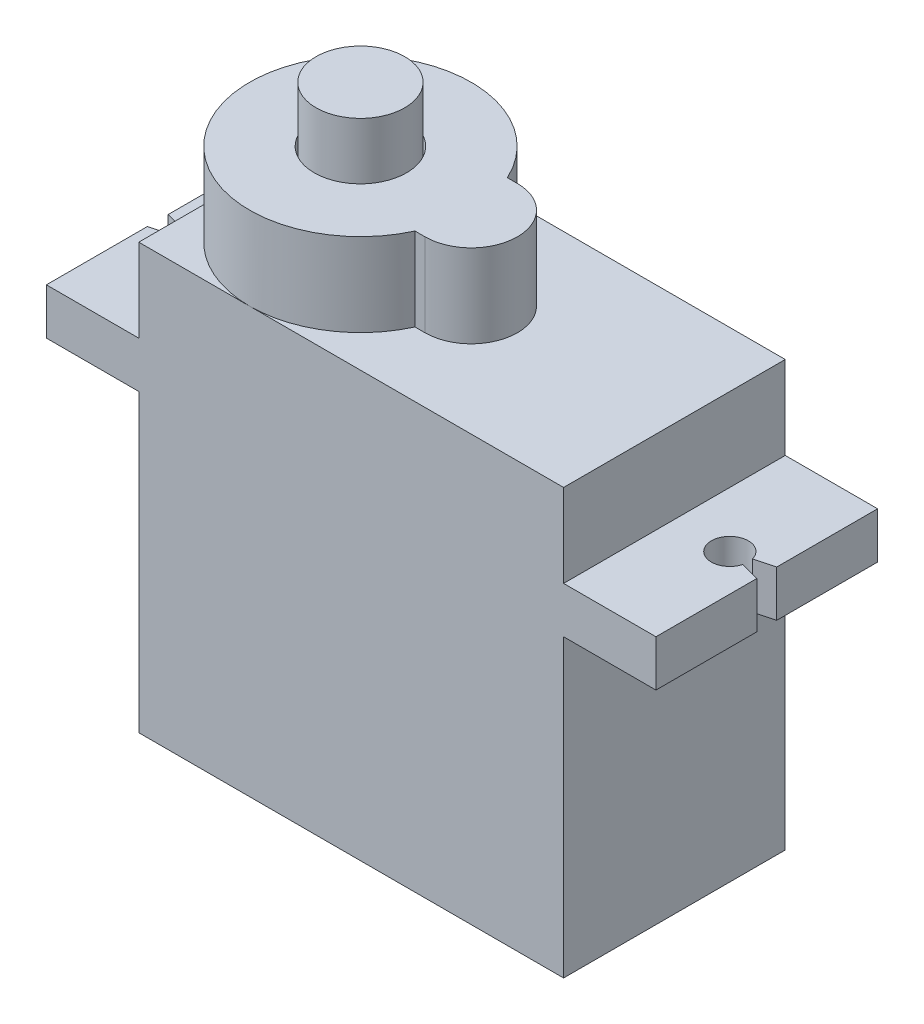
ISO-10303-21;
HEADER;
FILE_DESCRIPTION(('STEP AP214'),'2;1');
FILE_NAME('part.step','',(''),(''),'','','');
FILE_SCHEMA(('AUTOMOTIVE_DESIGN { 1 0 10303 214 1 1 1 1 }'));
ENDSEC;
DATA;
#1=APPLICATION_CONTEXT('core data for automotive mechanical design processes');
#2=APPLICATION_PROTOCOL_DEFINITION('international standard','automotive_design',2000,#1);
#3=PRODUCT_CONTEXT('',#1,'mechanical');
#4=PRODUCT('Part','Part','',(#3));
#5=PRODUCT_RELATED_PRODUCT_CATEGORY('part','',(#4));
#6=PRODUCT_DEFINITION_FORMATION('','',#4);
#7=PRODUCT_DEFINITION_CONTEXT('part definition',#1,'design');
#8=PRODUCT_DEFINITION('design','',#6,#7);
#9=PRODUCT_DEFINITION_SHAPE('','',#8);
#10=(LENGTH_UNIT() NAMED_UNIT(*) SI_UNIT(.MILLI.,.METRE.));
#11=(NAMED_UNIT(*) PLANE_ANGLE_UNIT() SI_UNIT($,.RADIAN.));
#12=(NAMED_UNIT(*) SI_UNIT($,.STERADIAN.) SOLID_ANGLE_UNIT());
#13=UNCERTAINTY_MEASURE_WITH_UNIT(LENGTH_MEASURE(1.E-05),#10,'distance_accuracy_value','');
#14=(GEOMETRIC_REPRESENTATION_CONTEXT(3) GLOBAL_UNCERTAINTY_ASSIGNED_CONTEXT((#13)) GLOBAL_UNIT_ASSIGNED_CONTEXT((#10,
#11,#12)) REPRESENTATION_CONTEXT('',''));
#15=CARTESIAN_POINT('',(0.,0.,0.));
#16=DIRECTION('',(0.,0.,1.));
#17=DIRECTION('',(1.,0.,0.));
#18=AXIS2_PLACEMENT_3D('',#15,#16,#17);
#19=CARTESIAN_POINT('',(16.5,7.,-6.));
#20=DIRECTION('',(1.,0.,0.));
#21=DIRECTION('',(0.,0.,-1.));
#22=AXIS2_PLACEMENT_3D('',#19,#20,#21);
#23=PLANE('',#22);
#24=DIRECTION('',(0.,1.,0.));
#25=VECTOR('',#24,1.);
#26=CARTESIAN_POINT('',(16.5,3.5,-0.53589838486223));
#27=LINE('',#26,#25);
#28=CARTESIAN_POINT('',(16.5,4.5,-0.53589838486223));
#29=VERTEX_POINT('',#28);
#30=CARTESIAN_POINT('',(16.5,7.,-0.53589838486223));
#31=VERTEX_POINT('',#30);
#32=EDGE_CURVE('E227',#29,#31,#27,.T.);
#33=ORIENTED_EDGE('',*,*,#32,.F.);
#34=DIRECTION('',(0.,0.,1.));
#35=VECTOR('',#34,1.);
#36=CARTESIAN_POINT('',(16.5,4.5,-6.));
#37=LINE('',#36,#35);
#38=CARTESIAN_POINT('',(16.5,4.5,-6.));
#39=VERTEX_POINT('',#38);
#40=EDGE_CURVE('E378',#39,#29,#37,.T.);
#41=ORIENTED_EDGE('',*,*,#40,.F.);
#42=DIRECTION('',(0.,1.,0.));
#43=VECTOR('',#42,1.);
#44=CARTESIAN_POINT('',(16.5,7.,-6.));
#45=LINE('',#44,#43);
#46=CARTESIAN_POINT('',(16.5,7.,-6.));
#47=VERTEX_POINT('',#46);
#48=EDGE_CURVE('E366',#39,#47,#45,.T.);
#49=ORIENTED_EDGE('',*,*,#48,.T.);
#50=DIRECTION('',(0.,0.,1.));
#51=VECTOR('',#50,1.);
#52=CARTESIAN_POINT('',(16.5,7.,-6.));
#53=LINE('',#52,#51);
#54=EDGE_CURVE('E375',#47,#31,#53,.T.);
#55=ORIENTED_EDGE('',*,*,#54,.T.);
#56=EDGE_LOOP('',(#33,#41,#49,#55));
#57=FACE_BOUND('',#56,.T.);
#58=ADVANCED_FACE('F32',(#57),#23,.T.);
#59=CARTESIAN_POINT('',(-16.5,7.,-6.));
#60=DIRECTION('',(-1.,0.,0.));
#61=DIRECTION('',(0.,0.,1.));
#62=AXIS2_PLACEMENT_3D('',#59,#60,#61);
#63=PLANE('',#62);
#64=DIRECTION('',(0.,1.,0.));
#65=VECTOR('',#64,1.);
#66=CARTESIAN_POINT('',(-16.5,3.5,0.535898384862233));
#67=LINE('',#66,#65);
#68=CARTESIAN_POINT('',(-16.5,4.5,0.535898384862233));
#69=VERTEX_POINT('',#68);
#70=CARTESIAN_POINT('',(-16.5,7.,0.535898384862233));
#71=VERTEX_POINT('',#70);
#72=EDGE_CURVE('E240',#69,#71,#67,.T.);
#73=ORIENTED_EDGE('',*,*,#72,.F.);
#74=DIRECTION('',(0.,0.,1.));
#75=VECTOR('',#74,1.);
#76=CARTESIAN_POINT('',(-16.5,4.49999999999999,-6.));
#77=LINE('',#76,#75);
#78=CARTESIAN_POINT('',(-16.5,4.49999999999999,6.));
#79=VERTEX_POINT('',#78);
#80=EDGE_CURVE('E393',#69,#79,#77,.T.);
#81=ORIENTED_EDGE('',*,*,#80,.T.);
#82=DIRECTION('',(0.,-1.,0.));
#83=VECTOR('',#82,1.);
#84=CARTESIAN_POINT('',(-16.5,7.,6.));
#85=LINE('',#84,#83);
#86=CARTESIAN_POINT('',(-16.5,7.,6.));
#87=VERTEX_POINT('',#86);
#88=EDGE_CURVE('E311',#87,#79,#85,.T.);
#89=ORIENTED_EDGE('',*,*,#88,.F.);
#90=DIRECTION('',(0.,0.,1.));
#91=VECTOR('',#90,1.);
#92=CARTESIAN_POINT('',(-16.5,7.,-6.));
#93=LINE('',#92,#91);
#94=EDGE_CURVE('E397',#71,#87,#93,.T.);
#95=ORIENTED_EDGE('',*,*,#94,.F.);
#96=EDGE_LOOP('',(#73,#81,#89,#95));
#97=FACE_BOUND('',#96,.T.);
#98=ADVANCED_FACE('F478',(#97),#63,.T.);
#99=CARTESIAN_POINT('',(-11.5,11.5,-6.));
#100=DIRECTION('',(0.,1.,0.));
#101=DIRECTION('',(0.,0.,1.));
#102=AXIS2_PLACEMENT_3D('',#99,#100,#101);
#103=PLANE('',#102);
#104=CARTESIAN_POINT('',(-5.50000000000001,11.5,0.));
#105=DIRECTION('',(0.,1.,0.));
#106=DIRECTION('',(0.,0.,1.));
#107=AXIS2_PLACEMENT_3D('',#104,#105,#106);
#108=CIRCLE('',#107,2.5);
#109=CARTESIAN_POINT('',(-5.50000000000001,11.5,2.5));
#110=VERTEX_POINT('',#109);
#111=EDGE_CURVE('E255',#110,#110,#108,.T.);
#112=ORIENTED_EDGE('',*,*,#111,.T.);
#113=EDGE_LOOP('',(#112));
#114=FACE_BOUND('',#113,.T.);
#115=CARTESIAN_POINT('',(-5.50000000000001,11.5,0.));
#116=DIRECTION('',(0.,1.,0.));
#117=DIRECTION('',(0.,0.,1.));
#118=AXIS2_PLACEMENT_3D('',#115,#116,#117);
#119=CIRCLE('',#118,2.4);
#120=CARTESIAN_POINT('',(-5.50000000000001,11.5,2.4));
#121=VERTEX_POINT('',#120);
#122=EDGE_CURVE('E251',#121,#121,#119,.T.);
#123=ORIENTED_EDGE('',*,*,#122,.F.);
#124=EDGE_LOOP('',(#123));
#125=FACE_BOUND('',#124,.T.);
#126=ADVANCED_FACE('F475',(#114,#125),#103,.T.);
#127=CARTESIAN_POINT('',(-5.50000000000001,11.5,0.));
#128=DIRECTION('',(0.,1.,0.));
#129=DIRECTION('',(0.,0.,1.));
#130=AXIS2_PLACEMENT_3D('',#127,#128,#129);
#131=CIRCLE('',#130,6.);
#132=CARTESIAN_POINT('',(-11.5,11.5,0.));
#133=VERTEX_POINT('',#132);
#134=CARTESIAN_POINT('',(-5.50000000000001,11.5,6.));
#135=VERTEX_POINT('',#134);
#136=EDGE_CURVE('E283',#133,#135,#131,.T.);
#137=ORIENTED_EDGE('',*,*,#136,.F.);
#138=DIRECTION('',(0.,0.,1.));
#139=VECTOR('',#138,1.);
#140=CARTESIAN_POINT('',(-11.5,11.5,-6.));
#141=LINE('',#140,#139);
#142=CARTESIAN_POINT('',(-11.5,11.5,6.));
#143=VERTEX_POINT('',#142);
#144=EDGE_CURVE('E403',#133,#143,#141,.T.);
#145=ORIENTED_EDGE('',*,*,#144,.T.);
#146=DIRECTION('',(-1.,0.,0.));
#147=VECTOR('',#146,1.);
#148=CARTESIAN_POINT('',(-11.5,11.5,6.));
#149=LINE('',#148,#147);
#150=EDGE_CURVE('E301',#135,#143,#149,.T.);
#151=ORIENTED_EDGE('',*,*,#150,.F.);
#152=EDGE_LOOP('',(#137,#145,#151));
#153=FACE_BOUND('',#152,.T.);
#154=ADVANCED_FACE('F439',(#153),#103,.T.);
#155=CARTESIAN_POINT('',(-0.0456439426821482,11.5,2.5));
#156=VERTEX_POINT('',#155);
#157=EDGE_CURVE('E429',#135,#156,#131,.T.);
#158=ORIENTED_EDGE('',*,*,#157,.F.);
#159=CARTESIAN_POINT('',(11.5,11.5,6.));
#160=VERTEX_POINT('',#159);
#161=EDGE_CURVE('E302',#160,#135,#149,.T.);
#162=ORIENTED_EDGE('',*,*,#161,.F.);
#163=DIRECTION('',(0.,0.,1.));
#164=VECTOR('',#163,1.);
#165=CARTESIAN_POINT('',(11.5,11.5,-6.));
#166=LINE('',#165,#164);
#167=CARTESIAN_POINT('',(11.5,11.5,-6.));
#168=VERTEX_POINT('',#167);
#169=EDGE_CURVE('E372',#168,#160,#166,.T.);
#170=ORIENTED_EDGE('',*,*,#169,.F.);
#171=DIRECTION('',(-1.,0.,0.));
#172=VECTOR('',#171,1.);
#173=CARTESIAN_POINT('',(-11.5,11.5,-6.));
#174=LINE('',#173,#172);
#175=CARTESIAN_POINT('',(-5.50000000000001,11.5,-6.));
#176=VERTEX_POINT('',#175);
#177=EDGE_CURVE('E339',#168,#176,#174,.T.);
#178=ORIENTED_EDGE('',*,*,#177,.T.);
#179=CARTESIAN_POINT('',(-0.0456439426821482,11.5,-2.5));
#180=VERTEX_POINT('',#179);
#181=EDGE_CURVE('E280',#180,#176,#131,.T.);
#182=ORIENTED_EDGE('',*,*,#181,.F.);
#183=DIRECTION('',(-1.,0.,0.));
#184=VECTOR('',#183,1.);
#185=CARTESIAN_POINT('',(0.499999999999994,11.5,-2.5));
#186=LINE('',#185,#184);
#187=CARTESIAN_POINT('',(0.499999999999994,11.5,-2.5));
#188=VERTEX_POINT('',#187);
#189=EDGE_CURVE('E277',#188,#180,#186,.T.);
#190=ORIENTED_EDGE('',*,*,#189,.F.);
#191=CARTESIAN_POINT('',(0.499999999999994,11.5,0.));
#192=DIRECTION('',(0.,1.,0.));
#193=DIRECTION('',(0.,0.,1.));
#194=AXIS2_PLACEMENT_3D('',#191,#192,#193);
#195=CIRCLE('',#194,2.5);
#196=CARTESIAN_POINT('',(0.499999999999994,11.5,2.5));
#197=VERTEX_POINT('',#196);
#198=EDGE_CURVE('E261',#197,#188,#195,.T.);
#199=ORIENTED_EDGE('',*,*,#198,.F.);
#200=DIRECTION('',(1.,0.,0.));
#201=VECTOR('',#200,1.);
#202=CARTESIAN_POINT('',(0.499999999999994,11.5,2.5));
#203=LINE('',#202,#201);
#204=EDGE_CURVE('E268',#156,#197,#203,.T.);
#205=ORIENTED_EDGE('',*,*,#204,.F.);
#206=EDGE_LOOP('',(#158,#162,#170,#178,#182,#190,#199,#205));
#207=FACE_BOUND('',#206,.T.);
#208=ADVANCED_FACE('F427',(#207),#103,.T.);
#209=CARTESIAN_POINT('',(11.5,7.,-6.));
#210=DIRECTION('',(1.,0.,0.));
#211=DIRECTION('',(0.,0.,-1.));
#212=AXIS2_PLACEMENT_3D('',#209,#210,#211);
#213=PLANE('',#212);
#214=ORIENTED_EDGE('',*,*,#169,.T.);
#215=DIRECTION('',(0.,1.,0.));
#216=VECTOR('',#215,1.);
#217=CARTESIAN_POINT('',(11.5,7.,6.));
#218=LINE('',#217,#216);
#219=CARTESIAN_POINT('',(11.5,7.,6.));
#220=VERTEX_POINT('',#219);
#221=EDGE_CURVE('E298',#220,#160,#218,.T.);
#222=ORIENTED_EDGE('',*,*,#221,.F.);
#223=DIRECTION('',(0.,0.,1.));
#224=VECTOR('',#223,1.);
#225=CARTESIAN_POINT('',(11.5,7.,-6.));
#226=LINE('',#225,#224);
#227=CARTESIAN_POINT('',(11.5,7.,-6.));
#228=VERTEX_POINT('',#227);
#229=EDGE_CURVE('E373',#228,#220,#226,.T.);
#230=ORIENTED_EDGE('',*,*,#229,.F.);
#231=DIRECTION('',(0.,1.,0.));
#232=VECTOR('',#231,1.);
#233=CARTESIAN_POINT('',(11.5,7.,-6.));
#234=LINE('',#233,#232);
#235=EDGE_CURVE('E335',#228,#168,#234,.T.);
#236=ORIENTED_EDGE('',*,*,#235,.T.);
#237=EDGE_LOOP('',(#214,#222,#230,#236));
#238=FACE_BOUND('',#237,.T.);
#239=ADVANCED_FACE('F34',(#238),#213,.T.);
#240=CARTESIAN_POINT('',(11.5,7.,-6.));
#241=DIRECTION('',(0.,1.,0.));
#242=DIRECTION('',(-1.,0.,0.));
#243=AXIS2_PLACEMENT_3D('',#240,#241,#242);
#244=PLANE('',#243);
#245=DIRECTION('',(-0.96592582628907,0.,0.258819045102514));
#246=VECTOR('',#245,1.);
#247=CARTESIAN_POINT('',(15.4659258262891,7.,-0.258819045102514));
#248=LINE('',#247,#246);
#249=CARTESIAN_POINT('',(15.4659258262891,7.,-0.258819045102514));
#250=VERTEX_POINT('',#249);
#251=EDGE_CURVE('E208',#31,#250,#248,.T.);
#252=ORIENTED_EDGE('',*,*,#251,.F.);
#253=ORIENTED_EDGE('',*,*,#54,.F.);
#254=DIRECTION('',(-1.,0.,0.));
#255=VECTOR('',#254,1.);
#256=CARTESIAN_POINT('',(11.5,7.,-6.));
#257=LINE('',#256,#255);
#258=EDGE_CURVE('E369',#47,#228,#257,.T.);
#259=ORIENTED_EDGE('',*,*,#258,.T.);
#260=ORIENTED_EDGE('',*,*,#229,.T.);
#261=DIRECTION('',(-1.,0.,0.));
#262=VECTOR('',#261,1.);
#263=CARTESIAN_POINT('',(11.5,7.,6.));
#264=LINE('',#263,#262);
#265=CARTESIAN_POINT('',(16.5,7.,6.));
#266=VERTEX_POINT('',#265);
#267=EDGE_CURVE('E332',#266,#220,#264,.T.);
#268=ORIENTED_EDGE('',*,*,#267,.F.);
#269=CARTESIAN_POINT('',(16.5,7.,0.535898384862212));
#270=VERTEX_POINT('',#269);
#271=EDGE_CURVE('E222',#270,#266,#53,.T.);
#272=ORIENTED_EDGE('',*,*,#271,.F.);
#273=DIRECTION('',(0.965925826289072,0.,0.258819045102506));
#274=VECTOR('',#273,1.);
#275=CARTESIAN_POINT('',(16.5,7.,0.535898384862212));
#276=LINE('',#275,#274);
#277=CARTESIAN_POINT('',(15.4659258262891,7.,0.258819045102506));
#278=VERTEX_POINT('',#277);
#279=EDGE_CURVE('E204',#278,#270,#276,.T.);
#280=ORIENTED_EDGE('',*,*,#279,.F.);
#281=CARTESIAN_POINT('',(14.5,7.,0.));
#282=DIRECTION('',(0.,1.,0.));
#283=DIRECTION('',(0.,0.,1.));
#284=AXIS2_PLACEMENT_3D('',#281,#282,#283);
#285=CIRCLE('',#284,1.);
#286=EDGE_CURVE('E211',#250,#278,#285,.T.);
#287=ORIENTED_EDGE('',*,*,#286,.F.);
#288=EDGE_LOOP('',(#252,#253,#259,#260,#268,#272,#280,#287));
#289=FACE_BOUND('',#288,.T.);
#290=ADVANCED_FACE('F220',(#289),#244,.T.);
#291=DIRECTION('',(0.,1.,0.));
#292=VECTOR('',#291,1.);
#293=CARTESIAN_POINT('',(16.5,3.5,0.535898384862212));
#294=LINE('',#293,#292);
#295=CARTESIAN_POINT('',(16.5,4.5,0.535898384862209));
#296=VERTEX_POINT('',#295);
#297=EDGE_CURVE('E47',#296,#270,#294,.T.);
#298=ORIENTED_EDGE('',*,*,#297,.T.);
#299=ORIENTED_EDGE('',*,*,#271,.T.);
#300=DIRECTION('',(0.,1.,0.));
#301=VECTOR('',#300,1.);
#302=CARTESIAN_POINT('',(16.5,7.,6.));
#303=LINE('',#302,#301);
#304=CARTESIAN_POINT('',(16.5,4.5,6.));
#305=VERTEX_POINT('',#304);
#306=EDGE_CURVE('E329',#305,#266,#303,.T.);
#307=ORIENTED_EDGE('',*,*,#306,.F.);
#308=EDGE_CURVE('E381',#296,#305,#37,.T.);
#309=ORIENTED_EDGE('',*,*,#308,.F.);
#310=EDGE_LOOP('',(#298,#299,#307,#309));
#311=FACE_BOUND('',#310,.T.);
#312=ADVANCED_FACE('F494',(#311),#23,.T.);
#313=CARTESIAN_POINT('',(16.5,4.5,-6.));
#314=DIRECTION('',(0.,-1.,0.));
#315=DIRECTION('',(1.,0.,0.));
#316=AXIS2_PLACEMENT_3D('',#313,#314,#315);
#317=PLANE('',#316);
#318=DIRECTION('',(0.96592582628907,0.,-0.258819045102514));
#319=VECTOR('',#318,1.);
#320=CARTESIAN_POINT('',(17.8660254037844,4.5,-0.901923788646649));
#321=LINE('',#320,#319);
#322=CARTESIAN_POINT('',(15.4659258262891,4.5,-0.258819045102514));
#323=VERTEX_POINT('',#322);
#324=EDGE_CURVE('E11',#323,#29,#321,.T.);
#325=ORIENTED_EDGE('',*,*,#324,.F.);
#326=CARTESIAN_POINT('',(14.5,4.5,0.));
#327=DIRECTION('',(0.,-1.,0.));
#328=DIRECTION('',(1.,0.,0.));
#329=AXIS2_PLACEMENT_3D('',#326,#327,#328);
#330=CIRCLE('',#329,1.);
#331=CARTESIAN_POINT('',(15.4659258262891,4.5,0.258819045102506));
#332=VERTEX_POINT('',#331);
#333=EDGE_CURVE('E40',#332,#323,#330,.T.);
#334=ORIENTED_EDGE('',*,*,#333,.F.);
#335=DIRECTION('',(-0.965925826289073,0.,-0.258819045102506));
#336=VECTOR('',#335,1.);
#337=CARTESIAN_POINT('',(14.8660254037845,4.5,0.0980762113533349));
#338=LINE('',#337,#336);
#339=EDGE_CURVE('E205',#296,#332,#338,.T.);
#340=ORIENTED_EDGE('',*,*,#339,.F.);
#341=ORIENTED_EDGE('',*,*,#308,.T.);
#342=DIRECTION('',(1.,0.,0.));
#343=VECTOR('',#342,1.);
#344=CARTESIAN_POINT('',(16.5,4.5,6.));
#345=LINE('',#344,#343);
#346=CARTESIAN_POINT('',(11.5,4.5,6.));
#347=VERTEX_POINT('',#346);
#348=EDGE_CURVE('E326',#347,#305,#345,.T.);
#349=ORIENTED_EDGE('',*,*,#348,.F.);
#350=DIRECTION('',(0.,0.,1.));
#351=VECTOR('',#350,1.);
#352=CARTESIAN_POINT('',(11.5,4.5,-6.));
#353=LINE('',#352,#351);
#354=CARTESIAN_POINT('',(11.5,4.5,-6.));
#355=VERTEX_POINT('',#354);
#356=EDGE_CURVE('E382',#355,#347,#353,.T.);
#357=ORIENTED_EDGE('',*,*,#356,.F.);
#358=DIRECTION('',(1.,0.,0.));
#359=VECTOR('',#358,1.);
#360=CARTESIAN_POINT('',(16.5,4.5,-6.));
#361=LINE('',#360,#359);
#362=EDGE_CURVE('E363',#355,#39,#361,.T.);
#363=ORIENTED_EDGE('',*,*,#362,.T.);
#364=ORIENTED_EDGE('',*,*,#40,.T.);
#365=EDGE_LOOP('',(#325,#334,#340,#341,#349,#357,#363,#364));
#366=FACE_BOUND('',#365,.T.);
#367=ADVANCED_FACE('F410',(#366),#317,.T.);
#368=CARTESIAN_POINT('',(11.5,-11.5,-6.));
#369=DIRECTION('',(1.,0.,0.));
#370=DIRECTION('',(0.,0.,-1.));
#371=AXIS2_PLACEMENT_3D('',#368,#369,#370);
#372=PLANE('',#371);
#373=ORIENTED_EDGE('',*,*,#356,.T.);
#374=DIRECTION('',(0.,1.,0.));
#375=VECTOR('',#374,1.);
#376=CARTESIAN_POINT('',(11.5,-11.5,6.));
#377=LINE('',#376,#375);
#378=CARTESIAN_POINT('',(11.5,-11.5,6.));
#379=VERTEX_POINT('',#378);
#380=EDGE_CURVE('E323',#379,#347,#377,.T.);
#381=ORIENTED_EDGE('',*,*,#380,.F.);
#382=DIRECTION('',(0.,0.,1.));
#383=VECTOR('',#382,1.);
#384=CARTESIAN_POINT('',(11.5,-11.5,-6.));
#385=LINE('',#384,#383);
#386=CARTESIAN_POINT('',(11.5,-11.5,-6.));
#387=VERTEX_POINT('',#386);
#388=EDGE_CURVE('E384',#387,#379,#385,.T.);
#389=ORIENTED_EDGE('',*,*,#388,.F.);
#390=DIRECTION('',(0.,1.,0.));
#391=VECTOR('',#390,1.);
#392=CARTESIAN_POINT('',(11.5,-11.5,-6.));
#393=LINE('',#392,#391);
#394=EDGE_CURVE('E360',#387,#355,#393,.T.);
#395=ORIENTED_EDGE('',*,*,#394,.T.);
#396=EDGE_LOOP('',(#373,#381,#389,#395));
#397=FACE_BOUND('',#396,.T.);
#398=ADVANCED_FACE('F509',(#397),#372,.T.);
#399=CARTESIAN_POINT('',(-11.5,-11.5,-6.));
#400=DIRECTION('',(0.,-1.,0.));
#401=DIRECTION('',(0.,0.,-1.));
#402=AXIS2_PLACEMENT_3D('',#399,#400,#401);
#403=PLANE('',#402);
#404=ORIENTED_EDGE('',*,*,#388,.T.);
#405=DIRECTION('',(1.,0.,0.));
#406=VECTOR('',#405,1.);
#407=CARTESIAN_POINT('',(-11.5,-11.5,6.));
#408=LINE('',#407,#406);
#409=CARTESIAN_POINT('',(-11.5,-11.5,6.));
#410=VERTEX_POINT('',#409);
#411=EDGE_CURVE('E320',#410,#379,#408,.T.);
#412=ORIENTED_EDGE('',*,*,#411,.F.);
#413=DIRECTION('',(0.,0.,1.));
#414=VECTOR('',#413,1.);
#415=CARTESIAN_POINT('',(-11.5,-11.5,-6.));
#416=LINE('',#415,#414);
#417=CARTESIAN_POINT('',(-11.5,-11.5,-6.));
#418=VERTEX_POINT('',#417);
#419=EDGE_CURVE('E386',#418,#410,#416,.T.);
#420=ORIENTED_EDGE('',*,*,#419,.F.);
#421=DIRECTION('',(1.,0.,0.));
#422=VECTOR('',#421,1.);
#423=CARTESIAN_POINT('',(-11.5,-11.5,-6.));
#424=LINE('',#423,#422);
#425=EDGE_CURVE('E357',#418,#387,#424,.T.);
#426=ORIENTED_EDGE('',*,*,#425,.T.);
#427=EDGE_LOOP('',(#404,#412,#420,#426));
#428=FACE_BOUND('',#427,.T.);
#429=ADVANCED_FACE('F518',(#428),#403,.T.);
#430=CARTESIAN_POINT('',(-11.5,-11.5,-6.));
#431=DIRECTION('',(-1.,0.,0.));
#432=DIRECTION('',(0.,0.,1.));
#433=AXIS2_PLACEMENT_3D('',#430,#431,#432);
#434=PLANE('',#433);
#435=ORIENTED_EDGE('',*,*,#419,.T.);
#436=DIRECTION('',(0.,-1.,0.));
#437=VECTOR('',#436,1.);
#438=CARTESIAN_POINT('',(-11.5,-11.5,6.));
#439=LINE('',#438,#437);
#440=CARTESIAN_POINT('',(-11.5,4.49999999999999,6.));
#441=VERTEX_POINT('',#440);
#442=EDGE_CURVE('E317',#441,#410,#439,.T.);
#443=ORIENTED_EDGE('',*,*,#442,.F.);
#444=DIRECTION('',(0.,0.,1.));
#445=VECTOR('',#444,1.);
#446=CARTESIAN_POINT('',(-11.5,4.49999999999999,-6.));
#447=LINE('',#446,#445);
#448=CARTESIAN_POINT('',(-11.5,4.49999999999999,-6.));
#449=VERTEX_POINT('',#448);
#450=EDGE_CURVE('E388',#449,#441,#447,.T.);
#451=ORIENTED_EDGE('',*,*,#450,.F.);
#452=DIRECTION('',(0.,-1.,0.));
#453=VECTOR('',#452,1.);
#454=CARTESIAN_POINT('',(-11.5,-11.5,-6.));
#455=LINE('',#454,#453);
#456=EDGE_CURVE('E354',#449,#418,#455,.T.);
#457=ORIENTED_EDGE('',*,*,#456,.T.);
#458=EDGE_LOOP('',(#435,#443,#451,#457));
#459=FACE_BOUND('',#458,.T.);
#460=ADVANCED_FACE('F521',(#459),#434,.T.);
#461=CARTESIAN_POINT('',(-16.5,4.49999999999999,-6.));
#462=DIRECTION('',(0.,-1.,0.));
#463=DIRECTION('',(1.,0.,0.));
#464=AXIS2_PLACEMENT_3D('',#461,#462,#463);
#465=PLANE('',#464);
#466=DIRECTION('',(-0.96592582628907,0.,0.258819045102513));
#467=VECTOR('',#466,1.);
#468=CARTESIAN_POINT('',(-14.8660254037845,4.49999999999999,0.0980762113533288));
#469=LINE('',#468,#467);
#470=CARTESIAN_POINT('',(-15.4340383646763,4.49999999999999,0.250274825514696));
#471=VERTEX_POINT('',#470);
#472=EDGE_CURVE('E247',#471,#69,#469,.T.);
#473=ORIENTED_EDGE('',*,*,#472,.F.);
#474=CARTESIAN_POINT('',(-14.488688457432,4.49999999999999,-0.0757827658296395));
#475=DIRECTION('',(0.,-1.,0.));
#476=DIRECTION('',(1.,0.,0.));
#477=AXIS2_PLACEMENT_3D('',#474,#475,#476);
#478=CIRCLE('',#477,0.999999999999998);
#479=CARTESIAN_POINT('',(-15.4599460496148,4.49999999999999,-0.313813624390664));
#480=VERTEX_POINT('',#479);
#481=EDGE_CURVE('E249',#480,#471,#478,.T.);
#482=ORIENTED_EDGE('',*,*,#481,.F.);
#483=DIRECTION('',(0.965925826289073,0.,0.258819045102505));
#484=VECTOR('',#483,1.);
#485=CARTESIAN_POINT('',(-17.8518761898796,4.49999999999999,-0.95472937382624));
#486=LINE('',#485,#484);
#487=CARTESIAN_POINT('',(-16.5,4.5,-0.592495240481153));
#488=VERTEX_POINT('',#487);
#489=EDGE_CURVE('E239',#488,#480,#486,.T.);
#490=ORIENTED_EDGE('',*,*,#489,.F.);
#491=CARTESIAN_POINT('',(-16.5,4.49999999999999,-6.));
#492=VERTEX_POINT('',#491);
#493=EDGE_CURVE('E390',#492,#488,#77,.T.);
#494=ORIENTED_EDGE('',*,*,#493,.F.);
#495=DIRECTION('',(1.,0.,0.));
#496=VECTOR('',#495,1.);
#497=CARTESIAN_POINT('',(-16.5,4.49999999999999,-6.));
#498=LINE('',#497,#496);
#499=EDGE_CURVE('E351',#492,#449,#498,.T.);
#500=ORIENTED_EDGE('',*,*,#499,.T.);
#501=ORIENTED_EDGE('',*,*,#450,.T.);
#502=DIRECTION('',(1.,0.,0.));
#503=VECTOR('',#502,1.);
#504=CARTESIAN_POINT('',(-16.5,4.49999999999999,6.));
#505=LINE('',#504,#503);
#506=EDGE_CURVE('E314',#79,#441,#505,.T.);
#507=ORIENTED_EDGE('',*,*,#506,.F.);
#508=ORIENTED_EDGE('',*,*,#80,.F.);
#509=EDGE_LOOP('',(#473,#482,#490,#494,#500,#501,#507,#508));
#510=FACE_BOUND('',#509,.T.);
#511=ADVANCED_FACE('F527',(#510),#465,.T.);
#512=DIRECTION('',(0.,1.,0.));
#513=VECTOR('',#512,1.);
#514=CARTESIAN_POINT('',(-16.5,3.5,-0.592495240481153));
#515=LINE('',#514,#513);
#516=CARTESIAN_POINT('',(-16.5,7.,-0.592495240481153));
#517=VERTEX_POINT('',#516);
#518=EDGE_CURVE('E242',#488,#517,#515,.T.);
#519=ORIENTED_EDGE('',*,*,#518,.T.);
#520=CARTESIAN_POINT('',(-16.5,7.,-6.));
#521=VERTEX_POINT('',#520);
#522=EDGE_CURVE('E394',#521,#517,#93,.T.);
#523=ORIENTED_EDGE('',*,*,#522,.F.);
#524=DIRECTION('',(0.,-1.,0.));
#525=VECTOR('',#524,1.);
#526=CARTESIAN_POINT('',(-16.5,7.,-6.));
#527=LINE('',#526,#525);
#528=EDGE_CURVE('E348',#521,#492,#527,.T.);
#529=ORIENTED_EDGE('',*,*,#528,.T.);
#530=ORIENTED_EDGE('',*,*,#493,.T.);
#531=EDGE_LOOP('',(#519,#523,#529,#530));
#532=FACE_BOUND('',#531,.T.);
#533=ADVANCED_FACE('F500',(#532),#63,.T.);
#534=CARTESIAN_POINT('',(-11.5,7.,-6.));
#535=DIRECTION('',(0.,1.,0.));
#536=DIRECTION('',(0.,0.,1.));
#537=AXIS2_PLACEMENT_3D('',#534,#535,#536);
#538=PLANE('',#537);
#539=DIRECTION('',(0.96592582628907,0.,-0.258819045102513));
#540=VECTOR('',#539,1.);
#541=CARTESIAN_POINT('',(-15.4340383646763,7.,0.250274825514696));
#542=LINE('',#541,#540);
#543=CARTESIAN_POINT('',(-15.4340383646763,7.,0.250274825514696));
#544=VERTEX_POINT('',#543);
#545=EDGE_CURVE('E233',#71,#544,#542,.T.);
#546=ORIENTED_EDGE('',*,*,#545,.F.);
#547=ORIENTED_EDGE('',*,*,#94,.T.);
#548=DIRECTION('',(-1.,0.,0.));
#549=VECTOR('',#548,1.);
#550=CARTESIAN_POINT('',(-11.5,7.,6.));
#551=LINE('',#550,#549);
#552=CARTESIAN_POINT('',(-11.5,7.,6.));
#553=VERTEX_POINT('',#552);
#554=EDGE_CURVE('E308',#553,#87,#551,.T.);
#555=ORIENTED_EDGE('',*,*,#554,.F.);
#556=DIRECTION('',(0.,0.,1.));
#557=VECTOR('',#556,1.);
#558=CARTESIAN_POINT('',(-11.5,7.,-6.));
#559=LINE('',#558,#557);
#560=CARTESIAN_POINT('',(-11.5,7.,-6.));
#561=VERTEX_POINT('',#560);
#562=EDGE_CURVE('E398',#561,#553,#559,.T.);
#563=ORIENTED_EDGE('',*,*,#562,.F.);
#564=DIRECTION('',(-1.,0.,0.));
#565=VECTOR('',#564,1.);
#566=CARTESIAN_POINT('',(-11.5,7.,-6.));
#567=LINE('',#566,#565);
#568=EDGE_CURVE('E345',#561,#521,#567,.T.);
#569=ORIENTED_EDGE('',*,*,#568,.T.);
#570=ORIENTED_EDGE('',*,*,#522,.T.);
#571=DIRECTION('',(-0.965925826289073,0.,-0.258819045102505));
#572=VECTOR('',#571,1.);
#573=CARTESIAN_POINT('',(-15.4599460496148,7.,-0.313813624390664));
#574=LINE('',#573,#572);
#575=CARTESIAN_POINT('',(-15.4599460496148,7.,-0.313813624390666));
#576=VERTEX_POINT('',#575);
#577=EDGE_CURVE('E231',#576,#517,#574,.T.);
#578=ORIENTED_EDGE('',*,*,#577,.F.);
#579=CARTESIAN_POINT('',(-14.488688457432,7.,-0.0757827658296395));
#580=DIRECTION('',(0.,1.,0.));
#581=DIRECTION('',(0.,0.,1.));
#582=AXIS2_PLACEMENT_3D('',#579,#580,#581);
#583=CIRCLE('',#582,0.999999999999998);
#584=EDGE_CURVE('E55',#544,#576,#583,.T.);
#585=ORIENTED_EDGE('',*,*,#584,.F.);
#586=EDGE_LOOP('',(#546,#547,#555,#563,#569,#570,#578,#585));
#587=FACE_BOUND('',#586,.T.);
#588=ADVANCED_FACE('F534',(#587),#538,.T.);
#589=CARTESIAN_POINT('',(-11.5,7.,-6.));
#590=DIRECTION('',(-1.,0.,0.));
#591=DIRECTION('',(0.,0.,1.));
#592=AXIS2_PLACEMENT_3D('',#589,#590,#591);
#593=PLANE('',#592);
#594=ORIENTED_EDGE('',*,*,#562,.T.);
#595=DIRECTION('',(0.,-1.,0.));
#596=VECTOR('',#595,1.);
#597=CARTESIAN_POINT('',(-11.5,7.,6.));
#598=LINE('',#597,#596);
#599=EDGE_CURVE('E305',#143,#553,#598,.T.);
#600=ORIENTED_EDGE('',*,*,#599,.F.);
#601=ORIENTED_EDGE('',*,*,#144,.F.);
#602=CARTESIAN_POINT('',(-11.5,11.5,-6.));
#603=VERTEX_POINT('',#602);
#604=EDGE_CURVE('E400',#603,#133,#141,.T.);
#605=ORIENTED_EDGE('',*,*,#604,.F.);
#606=DIRECTION('',(0.,-1.,0.));
#607=VECTOR('',#606,1.);
#608=CARTESIAN_POINT('',(-11.5,7.,-6.));
#609=LINE('',#608,#607);
#610=EDGE_CURVE('E342',#603,#561,#609,.T.);
#611=ORIENTED_EDGE('',*,*,#610,.T.);
#612=EDGE_LOOP('',(#594,#600,#601,#605,#611));
#613=FACE_BOUND('',#612,.T.);
#614=ADVANCED_FACE('F443',(#613),#593,.T.);
#615=EDGE_CURVE('E284',#176,#133,#131,.T.);
#616=ORIENTED_EDGE('',*,*,#615,.F.);
#617=EDGE_CURVE('E338',#176,#603,#174,.T.);
#618=ORIENTED_EDGE('',*,*,#617,.T.);
#619=ORIENTED_EDGE('',*,*,#604,.T.);
#620=EDGE_LOOP('',(#616,#618,#619));
#621=FACE_BOUND('',#620,.T.);
#622=ADVANCED_FACE('F446',(#621),#103,.T.);
#623=CARTESIAN_POINT('',(0.,0.,-6.));
#624=DIRECTION('',(0.,0.,-1.));
#625=DIRECTION('',(-1.,0.,0.));
#626=AXIS2_PLACEMENT_3D('',#623,#624,#625);
#627=PLANE('',#626);
#628=ORIENTED_EDGE('',*,*,#235,.F.);
#629=ORIENTED_EDGE('',*,*,#258,.F.);
#630=ORIENTED_EDGE('',*,*,#48,.F.);
#631=ORIENTED_EDGE('',*,*,#362,.F.);
#632=ORIENTED_EDGE('',*,*,#394,.F.);
#633=ORIENTED_EDGE('',*,*,#425,.F.);
#634=ORIENTED_EDGE('',*,*,#456,.F.);
#635=ORIENTED_EDGE('',*,*,#499,.F.);
#636=ORIENTED_EDGE('',*,*,#528,.F.);
#637=ORIENTED_EDGE('',*,*,#568,.F.);
#638=ORIENTED_EDGE('',*,*,#610,.F.);
#639=ORIENTED_EDGE('',*,*,#617,.F.);
#640=ORIENTED_EDGE('',*,*,#177,.F.);
#641=EDGE_LOOP('',(#628,#629,#630,#631,#632,#633,#634,#635,#636,#637,#638,#639,#640));
#642=FACE_BOUND('',#641,.T.);
#643=ADVANCED_FACE('F417',(#642),#627,.T.);
#644=CARTESIAN_POINT('',(0.,0.,6.));
#645=DIRECTION('',(0.,0.,-1.));
#646=DIRECTION('',(-1.,0.,0.));
#647=AXIS2_PLACEMENT_3D('',#644,#645,#646);
#648=PLANE('',#647);
#649=ORIENTED_EDGE('',*,*,#221,.T.);
#650=ORIENTED_EDGE('',*,*,#161,.T.);
#651=ORIENTED_EDGE('',*,*,#150,.T.);
#652=ORIENTED_EDGE('',*,*,#599,.T.);
#653=ORIENTED_EDGE('',*,*,#554,.T.);
#654=ORIENTED_EDGE('',*,*,#88,.T.);
#655=ORIENTED_EDGE('',*,*,#506,.T.);
#656=ORIENTED_EDGE('',*,*,#442,.T.);
#657=ORIENTED_EDGE('',*,*,#411,.T.);
#658=ORIENTED_EDGE('',*,*,#380,.T.);
#659=ORIENTED_EDGE('',*,*,#348,.T.);
#660=ORIENTED_EDGE('',*,*,#306,.T.);
#661=ORIENTED_EDGE('',*,*,#267,.T.);
#662=EDGE_LOOP('',(#649,#650,#651,#652,#653,#654,#655,#656,#657,#658,#659,#660,#661));
#663=FACE_BOUND('',#662,.T.);
#664=ADVANCED_FACE('F423',(#663),#648,.F.);
#665=CARTESIAN_POINT('',(0.499999999999994,16.,0.));
#666=DIRECTION('',(0.,1.,0.));
#667=DIRECTION('',(0.,0.,1.));
#668=AXIS2_PLACEMENT_3D('',#665,#666,#667);
#669=PLANE('',#668);
#670=CARTESIAN_POINT('',(0.499999999999994,16.,0.));
#671=DIRECTION('',(0.,1.,0.));
#672=DIRECTION('',(0.,0.,1.));
#673=AXIS2_PLACEMENT_3D('',#670,#671,#672);
#674=CIRCLE('',#673,2.5);
#675=CARTESIAN_POINT('',(0.499999999999994,16.,2.5));
#676=VERTEX_POINT('',#675);
#677=CARTESIAN_POINT('',(0.499999999999994,16.,-2.5));
#678=VERTEX_POINT('',#677);
#679=EDGE_CURVE('E264',#676,#678,#674,.T.);
#680=ORIENTED_EDGE('',*,*,#679,.T.);
#681=DIRECTION('',(-1.,0.,0.));
#682=VECTOR('',#681,1.);
#683=CARTESIAN_POINT('',(0.499999999999994,16.,-2.5));
#684=LINE('',#683,#682);
#685=CARTESIAN_POINT('',(-0.0456439426821482,16.,-2.5));
#686=VERTEX_POINT('',#685);
#687=EDGE_CURVE('E267',#678,#686,#684,.T.);
#688=ORIENTED_EDGE('',*,*,#687,.T.);
#689=CARTESIAN_POINT('',(-5.50000000000001,16.,0.));
#690=DIRECTION('',(0.,1.,0.));
#691=DIRECTION('',(0.,0.,1.));
#692=AXIS2_PLACEMENT_3D('',#689,#690,#691);
#693=CIRCLE('',#692,6.);
#694=CARTESIAN_POINT('',(-0.0456439426821482,16.,2.5));
#695=VERTEX_POINT('',#694);
#696=EDGE_CURVE('E270',#686,#695,#693,.T.);
#697=ORIENTED_EDGE('',*,*,#696,.T.);
#698=DIRECTION('',(1.,0.,0.));
#699=VECTOR('',#698,1.);
#700=CARTESIAN_POINT('',(0.499999999999994,16.,2.5));
#701=LINE('',#700,#699);
#702=EDGE_CURVE('E272',#695,#676,#701,.T.);
#703=ORIENTED_EDGE('',*,*,#702,.T.);
#704=EDGE_LOOP('',(#680,#688,#697,#703));
#705=FACE_BOUND('',#704,.T.);
#706=CARTESIAN_POINT('',(-5.50000000000001,16.,0.));
#707=DIRECTION('',(0.,1.,0.));
#708=DIRECTION('',(0.,0.,1.));
#709=AXIS2_PLACEMENT_3D('',#706,#707,#708);
#710=CIRCLE('',#709,2.5);
#711=CARTESIAN_POINT('',(-5.50000000000001,16.,2.5));
#712=VERTEX_POINT('',#711);
#713=EDGE_CURVE('E258',#712,#712,#710,.T.);
#714=ORIENTED_EDGE('',*,*,#713,.F.);
#715=EDGE_LOOP('',(#714));
#716=FACE_BOUND('',#715,.T.);
#717=ADVANCED_FACE('F462',(#705,#716),#669,.T.);
#718=CARTESIAN_POINT('',(0.499999999999994,16.,0.));
#719=DIRECTION('',(0.,-1.,0.));
#720=DIRECTION('',(0.,0.,-1.));
#721=AXIS2_PLACEMENT_3D('',#718,#719,#720);
#722=CYLINDRICAL_SURFACE('',#721,2.5);
#723=ORIENTED_EDGE('',*,*,#198,.T.);
#724=DIRECTION('',(0.,-1.,0.));
#725=VECTOR('',#724,1.);
#726=CARTESIAN_POINT('',(0.499999999999994,16.,-2.5));
#727=LINE('',#726,#725);
#728=EDGE_CURVE('E295',#678,#188,#727,.T.);
#729=ORIENTED_EDGE('',*,*,#728,.F.);
#730=ORIENTED_EDGE('',*,*,#679,.F.);
#731=DIRECTION('',(0.,-1.,0.));
#732=VECTOR('',#731,1.);
#733=CARTESIAN_POINT('',(0.499999999999994,16.,2.5));
#734=LINE('',#733,#732);
#735=EDGE_CURVE('E274',#676,#197,#734,.T.);
#736=ORIENTED_EDGE('',*,*,#735,.T.);
#737=EDGE_LOOP('',(#723,#729,#730,#736));
#738=FACE_BOUND('',#737,.T.);
#739=ADVANCED_FACE('F460',(#738),#722,.T.);
#740=CARTESIAN_POINT('',(0.499999999999994,16.,-2.5));
#741=DIRECTION('',(0.,0.,1.));
#742=DIRECTION('',(1.,0.,0.));
#743=AXIS2_PLACEMENT_3D('',#740,#741,#742);
#744=PLANE('',#743);
#745=ORIENTED_EDGE('',*,*,#189,.T.);
#746=DIRECTION('',(0.,-1.,0.));
#747=VECTOR('',#746,1.);
#748=CARTESIAN_POINT('',(-0.0456439426821482,16.,-2.5));
#749=LINE('',#748,#747);
#750=EDGE_CURVE('E292',#686,#180,#749,.T.);
#751=ORIENTED_EDGE('',*,*,#750,.F.);
#752=ORIENTED_EDGE('',*,*,#687,.F.);
#753=ORIENTED_EDGE('',*,*,#728,.T.);
#754=EDGE_LOOP('',(#745,#751,#752,#753));
#755=FACE_BOUND('',#754,.T.);
#756=ADVANCED_FACE('F452',(#755),#744,.F.);
#757=CARTESIAN_POINT('',(-5.50000000000001,16.,0.));
#758=DIRECTION('',(0.,-1.,0.));
#759=DIRECTION('',(0.,0.,-1.));
#760=AXIS2_PLACEMENT_3D('',#757,#758,#759);
#761=CYLINDRICAL_SURFACE('',#760,6.);
#762=ORIENTED_EDGE('',*,*,#181,.T.);
#763=ORIENTED_EDGE('',*,*,#615,.T.);
#764=ORIENTED_EDGE('',*,*,#136,.T.);
#765=ORIENTED_EDGE('',*,*,#157,.T.);
#766=DIRECTION('',(0.,-1.,0.));
#767=VECTOR('',#766,1.);
#768=CARTESIAN_POINT('',(-0.0456439426821482,16.,2.5));
#769=LINE('',#768,#767);
#770=EDGE_CURVE('E289',#695,#156,#769,.T.);
#771=ORIENTED_EDGE('',*,*,#770,.F.);
#772=ORIENTED_EDGE('',*,*,#696,.F.);
#773=ORIENTED_EDGE('',*,*,#750,.T.);
#774=EDGE_LOOP('',(#762,#763,#764,#765,#771,#772,#773));
#775=FACE_BOUND('',#774,.T.);
#776=ADVANCED_FACE('F435',(#775),#761,.T.);
#777=CARTESIAN_POINT('',(0.499999999999994,16.,2.5));
#778=DIRECTION('',(0.,0.,-1.));
#779=DIRECTION('',(-1.,0.,0.));
#780=AXIS2_PLACEMENT_3D('',#777,#778,#779);
#781=PLANE('',#780);
#782=ORIENTED_EDGE('',*,*,#204,.T.);
#783=ORIENTED_EDGE('',*,*,#735,.F.);
#784=ORIENTED_EDGE('',*,*,#702,.F.);
#785=ORIENTED_EDGE('',*,*,#770,.T.);
#786=EDGE_LOOP('',(#782,#783,#784,#785));
#787=FACE_BOUND('',#786,.T.);
#788=ADVANCED_FACE('F457',(#787),#781,.F.);
#789=CARTESIAN_POINT('',(-5.50000000000001,16.,0.));
#790=DIRECTION('',(0.,-1.,0.));
#791=DIRECTION('',(0.,0.,-1.));
#792=AXIS2_PLACEMENT_3D('',#789,#790,#791);
#793=CYLINDRICAL_SURFACE('',#792,2.5);
#794=ORIENTED_EDGE('',*,*,#713,.T.);
#795=EDGE_LOOP('',(#794));
#796=FACE_BOUND('',#795,.T.);
#797=ORIENTED_EDGE('',*,*,#111,.F.);
#798=EDGE_LOOP('',(#797));
#799=FACE_BOUND('',#798,.T.);
#800=ADVANCED_FACE('F468',(#796,#799),#793,.F.);
#801=CARTESIAN_POINT('',(-5.50000000000001,19.,0.));
#802=DIRECTION('',(0.,-1.,0.));
#803=DIRECTION('',(0.,0.,-1.));
#804=AXIS2_PLACEMENT_3D('',#801,#802,#803);
#805=CYLINDRICAL_SURFACE('',#804,2.4);
#806=CARTESIAN_POINT('',(-5.50000000000001,19.,0.));
#807=DIRECTION('',(0.,1.,0.));
#808=DIRECTION('',(0.,0.,1.));
#809=AXIS2_PLACEMENT_3D('',#806,#807,#808);
#810=CIRCLE('',#809,2.4);
#811=CARTESIAN_POINT('',(-5.50000000000001,19.,2.4));
#812=VERTEX_POINT('',#811);
#813=EDGE_CURVE('E252',#812,#812,#810,.T.);
#814=ORIENTED_EDGE('',*,*,#813,.F.);
#815=EDGE_LOOP('',(#814));
#816=FACE_BOUND('',#815,.T.);
#817=ORIENTED_EDGE('',*,*,#122,.T.);
#818=EDGE_LOOP('',(#817));
#819=FACE_BOUND('',#818,.T.);
#820=ADVANCED_FACE('F471',(#816,#819),#805,.T.);
#821=CARTESIAN_POINT('',(-5.50000000000001,19.,0.));
#822=DIRECTION('',(0.,1.,0.));
#823=DIRECTION('',(0.,0.,1.));
#824=AXIS2_PLACEMENT_3D('',#821,#822,#823);
#825=PLANE('',#824);
#826=ORIENTED_EDGE('',*,*,#813,.T.);
#827=EDGE_LOOP('',(#826));
#828=FACE_BOUND('',#827,.T.);
#829=ADVANCED_FACE('F482',(#828),#825,.T.);
#830=CARTESIAN_POINT('',(-14.488688457432,3.5,-0.0757827658296395));
#831=DIRECTION('',(0.,1.,0.));
#832=DIRECTION('',(0.,0.,1.));
#833=AXIS2_PLACEMENT_3D('',#830,#831,#832);
#834=CYLINDRICAL_SURFACE('',#833,0.999999999999998);
#835=ORIENTED_EDGE('',*,*,#481,.T.);
#836=DIRECTION('',(0.,1.,0.));
#837=VECTOR('',#836,1.);
#838=CARTESIAN_POINT('',(-15.4340383646763,3.5,0.250274825514696));
#839=LINE('',#838,#837);
#840=EDGE_CURVE('E237',#471,#544,#839,.T.);
#841=ORIENTED_EDGE('',*,*,#840,.T.);
#842=ORIENTED_EDGE('',*,*,#584,.T.);
#843=DIRECTION('',(0.,1.,0.));
#844=VECTOR('',#843,1.);
#845=CARTESIAN_POINT('',(-15.4599460496148,3.5,-0.313813624390664));
#846=LINE('',#845,#844);
#847=EDGE_CURVE('E236',#480,#576,#846,.T.);
#848=ORIENTED_EDGE('',*,*,#847,.F.);
#849=EDGE_LOOP('',(#835,#841,#842,#848));
#850=FACE_BOUND('',#849,.T.);
#851=ADVANCED_FACE('F488',(#850),#834,.F.);
#852=CARTESIAN_POINT('',(-15.4340383646763,3.5,0.250274825514696));
#853=DIRECTION('',(0.258819045102513,0.,0.96592582628907));
#854=DIRECTION('',(0.96592582628907,0.,-0.258819045102513));
#855=AXIS2_PLACEMENT_3D('',#852,#853,#854);
#856=PLANE('',#855);
#857=ORIENTED_EDGE('',*,*,#472,.T.);
#858=ORIENTED_EDGE('',*,*,#72,.T.);
#859=ORIENTED_EDGE('',*,*,#545,.T.);
#860=ORIENTED_EDGE('',*,*,#840,.F.);
#861=EDGE_LOOP('',(#857,#858,#859,#860));
#862=FACE_BOUND('',#861,.T.);
#863=ADVANCED_FACE('F539',(#862),#856,.F.);
#864=CARTESIAN_POINT('',(-15.4599460496148,3.5,-0.313813624390664));
#865=DIRECTION('',(0.258819045102505,0.,-0.965925826289073));
#866=DIRECTION('',(-0.965925826289073,0.,-0.258819045102505));
#867=AXIS2_PLACEMENT_3D('',#864,#865,#866);
#868=PLANE('',#867);
#869=ORIENTED_EDGE('',*,*,#489,.T.);
#870=ORIENTED_EDGE('',*,*,#847,.T.);
#871=ORIENTED_EDGE('',*,*,#577,.T.);
#872=ORIENTED_EDGE('',*,*,#518,.F.);
#873=EDGE_LOOP('',(#869,#870,#871,#872));
#874=FACE_BOUND('',#873,.T.);
#875=ADVANCED_FACE('F544',(#874),#868,.F.);
#876=CARTESIAN_POINT('',(14.5,3.5,0.));
#877=DIRECTION('',(0.,1.,0.));
#878=DIRECTION('',(0.,0.,1.));
#879=AXIS2_PLACEMENT_3D('',#876,#877,#878);
#880=CYLINDRICAL_SURFACE('',#879,1.);
#881=ORIENTED_EDGE('',*,*,#333,.T.);
#882=DIRECTION('',(0.,1.,0.));
#883=VECTOR('',#882,1.);
#884=CARTESIAN_POINT('',(15.4659258262891,3.5,-0.258819045102514));
#885=LINE('',#884,#883);
#886=EDGE_CURVE('E214',#323,#250,#885,.T.);
#887=ORIENTED_EDGE('',*,*,#886,.T.);
#888=ORIENTED_EDGE('',*,*,#286,.T.);
#889=DIRECTION('',(0.,1.,0.));
#890=VECTOR('',#889,1.);
#891=CARTESIAN_POINT('',(15.4659258262891,3.5,0.258819045102506));
#892=LINE('',#891,#890);
#893=EDGE_CURVE('E200',#332,#278,#892,.T.);
#894=ORIENTED_EDGE('',*,*,#893,.F.);
#895=EDGE_LOOP('',(#881,#887,#888,#894));
#896=FACE_BOUND('',#895,.T.);
#897=ADVANCED_FACE('F212',(#896),#880,.F.);
#898=CARTESIAN_POINT('',(15.4659258262891,3.5,-0.258819045102514));
#899=DIRECTION('',(-0.258819045102514,0.,-0.96592582628907));
#900=DIRECTION('',(-0.96592582628907,0.,0.258819045102514));
#901=AXIS2_PLACEMENT_3D('',#898,#899,#900);
#902=PLANE('',#901);
#903=ORIENTED_EDGE('',*,*,#324,.T.);
#904=ORIENTED_EDGE('',*,*,#32,.T.);
#905=ORIENTED_EDGE('',*,*,#251,.T.);
#906=ORIENTED_EDGE('',*,*,#886,.F.);
#907=EDGE_LOOP('',(#903,#904,#905,#906));
#908=FACE_BOUND('',#907,.T.);
#909=ADVANCED_FACE('F408',(#908),#902,.F.);
#910=CARTESIAN_POINT('',(16.5,3.5,0.535898384862212));
#911=DIRECTION('',(-0.258819045102506,0.,0.965925826289072));
#912=DIRECTION('',(0.965925826289073,0.,0.258819045102506));
#913=AXIS2_PLACEMENT_3D('',#910,#911,#912);
#914=PLANE('',#913);
#915=ORIENTED_EDGE('',*,*,#339,.T.);
#916=ORIENTED_EDGE('',*,*,#893,.T.);
#917=ORIENTED_EDGE('',*,*,#279,.T.);
#918=ORIENTED_EDGE('',*,*,#297,.F.);
#919=EDGE_LOOP('',(#915,#916,#917,#918));
#920=FACE_BOUND('',#919,.T.);
#921=ADVANCED_FACE('F202',(#920),#914,.F.);
#922=CLOSED_SHELL('',(#58,#98,#126,#154,#208,#239,#290,#312,#367,#398,#429,#460,#511,#533,#588,
#614,#622,#643,#664,#717,#739,#756,#776,#788,#800,#820,#829,#851,#863,#875,#897,#909,#921));
#923=MANIFOLD_SOLID_BREP('B2',#922);
#924=ADVANCED_BREP_SHAPE_REPRESENTATION('',(#18,#923),#14);
#925=SHAPE_DEFINITION_REPRESENTATION(#9,#924);
ENDSEC;
END-ISO-10303-21;
